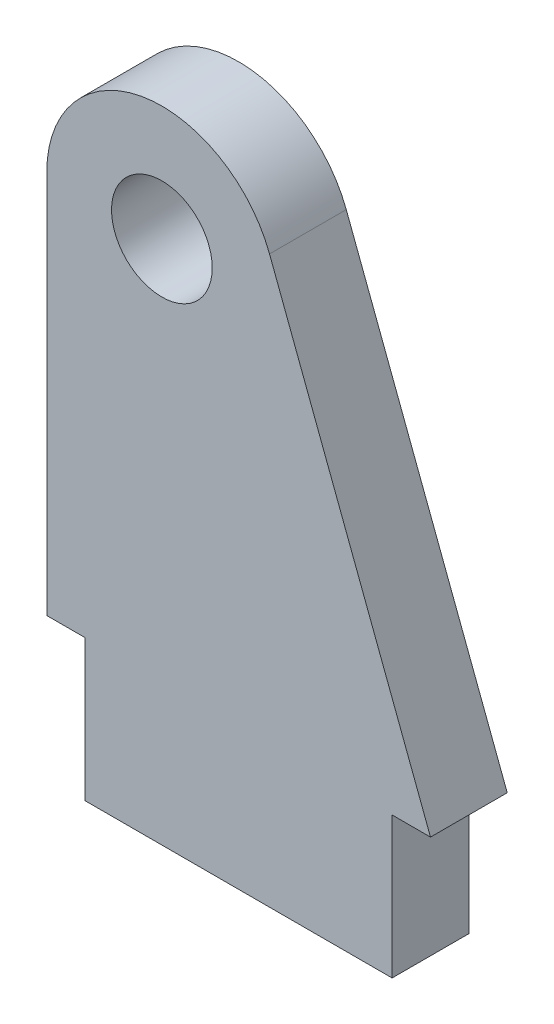
ISO-10303-21;
HEADER;
FILE_DESCRIPTION(('STEP AP214'),'2;1');
FILE_NAME('part.step','',(''),(''),'','','');
FILE_SCHEMA(('AUTOMOTIVE_DESIGN { 1 0 10303 214 1 1 1 1 }'));
ENDSEC;
DATA;
#1=APPLICATION_CONTEXT('core data for automotive mechanical design processes');
#2=APPLICATION_PROTOCOL_DEFINITION('international standard','automotive_design',2000,#1);
#3=PRODUCT_CONTEXT('',#1,'mechanical');
#4=PRODUCT('Part','Part','',(#3));
#5=PRODUCT_RELATED_PRODUCT_CATEGORY('part','',(#4));
#6=PRODUCT_DEFINITION_FORMATION('','',#4);
#7=PRODUCT_DEFINITION_CONTEXT('part definition',#1,'design');
#8=PRODUCT_DEFINITION('design','',#6,#7);
#9=PRODUCT_DEFINITION_SHAPE('','',#8);
#10=(LENGTH_UNIT() NAMED_UNIT(*) SI_UNIT(.MILLI.,.METRE.));
#11=(NAMED_UNIT(*) PLANE_ANGLE_UNIT() SI_UNIT($,.RADIAN.));
#12=(NAMED_UNIT(*) SI_UNIT($,.STERADIAN.) SOLID_ANGLE_UNIT());
#13=UNCERTAINTY_MEASURE_WITH_UNIT(LENGTH_MEASURE(1.E-05),#10,'distance_accuracy_value','');
#14=(GEOMETRIC_REPRESENTATION_CONTEXT(3) GLOBAL_UNCERTAINTY_ASSIGNED_CONTEXT((#13)) GLOBAL_UNIT_ASSIGNED_CONTEXT((#10,
#11,#12)) REPRESENTATION_CONTEXT('',''));
#15=CARTESIAN_POINT('',(0.,0.,0.));
#16=DIRECTION('',(0.,0.,1.));
#17=DIRECTION('',(1.,0.,0.));
#18=AXIS2_PLACEMENT_3D('',#15,#16,#17);
#19=CARTESIAN_POINT('',(-3.175,18.796,3.175));
#20=DIRECTION('',(0.,0.,1.));
#21=DIRECTION('',(1.,0.,0.));
#22=AXIS2_PLACEMENT_3D('',#19,#20,#21);
#23=PLANE('',#22);
#24=DIRECTION('',(1.,0.,0.));
#25=VECTOR('',#24,1.);
#26=CARTESIAN_POINT('',(-7.9375,2.921,3.175));
#27=LINE('',#26,#25);
#28=CARTESIAN_POINT('',(-7.9375,2.921,3.175));
#29=VERTEX_POINT('',#28);
#30=CARTESIAN_POINT('',(-6.35,2.921,3.175));
#31=VERTEX_POINT('',#30);
#32=EDGE_CURVE('E149',#29,#31,#27,.T.);
#33=ORIENTED_EDGE('',*,*,#32,.T.);
#34=DIRECTION('',(0.,-1.,0.));
#35=VECTOR('',#34,1.);
#36=CARTESIAN_POINT('',(-6.35,-2.921,3.175));
#37=LINE('',#36,#35);
#38=CARTESIAN_POINT('',(-6.35,-2.921,3.175));
#39=VERTEX_POINT('',#38);
#40=EDGE_CURVE('E97',#31,#39,#37,.T.);
#41=ORIENTED_EDGE('',*,*,#40,.T.);
#42=DIRECTION('',(1.,0.,0.));
#43=VECTOR('',#42,1.);
#44=CARTESIAN_POINT('',(6.35,-2.921,3.175));
#45=LINE('',#44,#43);
#46=CARTESIAN_POINT('',(6.35,-2.921,3.175));
#47=VERTEX_POINT('',#46);
#48=EDGE_CURVE('E164',#39,#47,#45,.T.);
#49=ORIENTED_EDGE('',*,*,#48,.T.);
#50=DIRECTION('',(0.,1.,0.));
#51=VECTOR('',#50,1.);
#52=CARTESIAN_POINT('',(6.35,-2.921,3.175));
#53=LINE('',#52,#51);
#54=CARTESIAN_POINT('',(6.35,2.921,3.175));
#55=VERTEX_POINT('',#54);
#56=EDGE_CURVE('E177',#47,#55,#53,.T.);
#57=ORIENTED_EDGE('',*,*,#56,.T.);
#58=DIRECTION('',(1.,0.,0.));
#59=VECTOR('',#58,1.);
#60=CARTESIAN_POINT('',(6.35,2.921,3.175));
#61=LINE('',#60,#59);
#62=CARTESIAN_POINT('',(7.9375,2.921,3.175));
#63=VERTEX_POINT('',#62);
#64=EDGE_CURVE('E116',#55,#63,#61,.T.);
#65=ORIENTED_EDGE('',*,*,#64,.T.);
#66=DIRECTION('',(-0.354530986331508,0.935044266187868,0.));
#67=VECTOR('',#66,1.);
#68=CARTESIAN_POINT('',(7.9375,2.921,3.175));
#69=LINE('',#68,#67);
#70=CARTESIAN_POINT('',(1.27814831771972,20.4844538224038,3.175));
#71=VERTEX_POINT('',#70);
#72=EDGE_CURVE('E110',#63,#71,#69,.T.);
#73=ORIENTED_EDGE('',*,*,#72,.T.);
#74=CARTESIAN_POINT('',(-3.175,18.796,3.175));
#75=DIRECTION('',(0.,0.,1.));
#76=DIRECTION('',(1.,0.,0.));
#77=AXIS2_PLACEMENT_3D('',#74,#75,#76);
#78=CIRCLE('',#77,4.7625);
#79=CARTESIAN_POINT('',(-7.9375,18.796,3.175));
#80=VERTEX_POINT('',#79);
#81=EDGE_CURVE('E114',#71,#80,#78,.T.);
#82=ORIENTED_EDGE('',*,*,#81,.T.);
#83=DIRECTION('',(0.,-1.,0.));
#84=VECTOR('',#83,1.);
#85=CARTESIAN_POINT('',(-7.9375,2.921,3.175));
#86=LINE('',#85,#84);
#87=EDGE_CURVE('E54',#80,#29,#86,.T.);
#88=ORIENTED_EDGE('',*,*,#87,.T.);
#89=EDGE_LOOP('',(#33,#41,#49,#57,#65,#73,#82,#88));
#90=FACE_BOUND('',#89,.T.);
#91=CARTESIAN_POINT('',(-3.175,18.796,3.175));
#92=DIRECTION('',(0.,0.,1.));
#93=DIRECTION('',(1.,0.,0.));
#94=AXIS2_PLACEMENT_3D('',#91,#92,#93);
#95=CIRCLE('',#94,2.0828);
#96=CARTESIAN_POINT('',(-1.0922,18.796,3.175));
#97=VERTEX_POINT('',#96);
#98=EDGE_CURVE('E138',#97,#97,#95,.T.);
#99=ORIENTED_EDGE('',*,*,#98,.F.);
#100=EDGE_LOOP('',(#99));
#101=FACE_BOUND('',#100,.T.);
#102=ADVANCED_FACE('F37',(#90,#101),#23,.T.);
#103=CARTESIAN_POINT('',(-3.175,18.796,0.));
#104=DIRECTION('',(0.,0.,1.));
#105=DIRECTION('',(1.,0.,0.));
#106=AXIS2_PLACEMENT_3D('',#103,#104,#105);
#107=PLANE('',#106);
#108=DIRECTION('',(1.,0.,0.));
#109=VECTOR('',#108,1.);
#110=CARTESIAN_POINT('',(-7.9375,2.921,0.));
#111=LINE('',#110,#109);
#112=CARTESIAN_POINT('',(-7.9375,2.921,0.));
#113=VERTEX_POINT('',#112);
#114=CARTESIAN_POINT('',(-6.35,2.921,0.));
#115=VERTEX_POINT('',#114);
#116=EDGE_CURVE('E134',#113,#115,#111,.T.);
#117=ORIENTED_EDGE('',*,*,#116,.F.);
#118=DIRECTION('',(0.,-1.,0.));
#119=VECTOR('',#118,1.);
#120=CARTESIAN_POINT('',(-7.9375,2.921,0.));
#121=LINE('',#120,#119);
#122=CARTESIAN_POINT('',(-7.9375,18.796,0.));
#123=VERTEX_POINT('',#122);
#124=EDGE_CURVE('E89',#123,#113,#121,.T.);
#125=ORIENTED_EDGE('',*,*,#124,.F.);
#126=CARTESIAN_POINT('',(-3.175,18.796,0.));
#127=DIRECTION('',(0.,0.,1.));
#128=DIRECTION('',(1.,0.,0.));
#129=AXIS2_PLACEMENT_3D('',#126,#127,#128);
#130=CIRCLE('',#129,4.7625);
#131=CARTESIAN_POINT('',(1.27814831771972,20.4844538224038,0.));
#132=VERTEX_POINT('',#131);
#133=EDGE_CURVE('E83',#132,#123,#130,.T.);
#134=ORIENTED_EDGE('',*,*,#133,.F.);
#135=DIRECTION('',(-0.354530986331508,0.935044266187868,0.));
#136=VECTOR('',#135,1.);
#137=CARTESIAN_POINT('',(7.9375,2.921,0.));
#138=LINE('',#137,#136);
#139=CARTESIAN_POINT('',(7.9375,2.921,0.));
#140=VERTEX_POINT('',#139);
#141=EDGE_CURVE('E124',#140,#132,#138,.T.);
#142=ORIENTED_EDGE('',*,*,#141,.F.);
#143=DIRECTION('',(1.,0.,0.));
#144=VECTOR('',#143,1.);
#145=CARTESIAN_POINT('',(6.35,2.921,0.));
#146=LINE('',#145,#144);
#147=CARTESIAN_POINT('',(6.35,2.921,0.));
#148=VERTEX_POINT('',#147);
#149=EDGE_CURVE('E144',#148,#140,#146,.T.);
#150=ORIENTED_EDGE('',*,*,#149,.F.);
#151=DIRECTION('',(0.,1.,0.));
#152=VECTOR('',#151,1.);
#153=CARTESIAN_POINT('',(6.35,-2.921,0.));
#154=LINE('',#153,#152);
#155=CARTESIAN_POINT('',(6.35,-2.921,0.));
#156=VERTEX_POINT('',#155);
#157=EDGE_CURVE('E142',#156,#148,#154,.T.);
#158=ORIENTED_EDGE('',*,*,#157,.F.);
#159=DIRECTION('',(1.,0.,0.));
#160=VECTOR('',#159,1.);
#161=CARTESIAN_POINT('',(6.35,-2.921,0.));
#162=LINE('',#161,#160);
#163=CARTESIAN_POINT('',(-6.35,-2.921,0.));
#164=VERTEX_POINT('',#163);
#165=EDGE_CURVE('E140',#164,#156,#162,.T.);
#166=ORIENTED_EDGE('',*,*,#165,.F.);
#167=DIRECTION('',(0.,-1.,0.));
#168=VECTOR('',#167,1.);
#169=CARTESIAN_POINT('',(-6.35,-2.921,0.));
#170=LINE('',#169,#168);
#171=EDGE_CURVE('E137',#115,#164,#170,.T.);
#172=ORIENTED_EDGE('',*,*,#171,.F.);
#173=EDGE_LOOP('',(#117,#125,#134,#142,#150,#158,#166,#172));
#174=FACE_BOUND('',#173,.T.);
#175=CARTESIAN_POINT('',(-3.175,18.796,0.));
#176=DIRECTION('',(0.,0.,1.));
#177=DIRECTION('',(1.,0.,0.));
#178=AXIS2_PLACEMENT_3D('',#175,#176,#177);
#179=CIRCLE('',#178,2.0828);
#180=CARTESIAN_POINT('',(-1.0922,18.796,0.));
#181=VERTEX_POINT('',#180);
#182=EDGE_CURVE('E183',#181,#181,#179,.T.);
#183=ORIENTED_EDGE('',*,*,#182,.T.);
#184=EDGE_LOOP('',(#183));
#185=FACE_BOUND('',#184,.T.);
#186=ADVANCED_FACE('F168',(#174,#185),#107,.F.);
#187=CARTESIAN_POINT('',(-7.9375,2.921,3.175));
#188=DIRECTION('',(0.,1.,0.));
#189=DIRECTION('',(0.,0.,1.));
#190=AXIS2_PLACEMENT_3D('',#187,#188,#189);
#191=PLANE('',#190);
#192=ORIENTED_EDGE('',*,*,#116,.T.);
#193=DIRECTION('',(0.,0.,-1.));
#194=VECTOR('',#193,1.);
#195=CARTESIAN_POINT('',(-6.35,2.921,3.175));
#196=LINE('',#195,#194);
#197=EDGE_CURVE('E11',#31,#115,#196,.T.);
#198=ORIENTED_EDGE('',*,*,#197,.F.);
#199=ORIENTED_EDGE('',*,*,#32,.F.);
#200=DIRECTION('',(0.,0.,-1.));
#201=VECTOR('',#200,1.);
#202=CARTESIAN_POINT('',(-7.9375,2.921,3.175));
#203=LINE('',#202,#201);
#204=EDGE_CURVE('E130',#29,#113,#203,.T.);
#205=ORIENTED_EDGE('',*,*,#204,.T.);
#206=EDGE_LOOP('',(#192,#198,#199,#205));
#207=FACE_BOUND('',#206,.T.);
#208=ADVANCED_FACE('F39',(#207),#191,.F.);
#209=CARTESIAN_POINT('',(-6.35,-2.921,3.175));
#210=DIRECTION('',(1.,0.,0.));
#211=DIRECTION('',(0.,0.,-1.));
#212=AXIS2_PLACEMENT_3D('',#209,#210,#211);
#213=PLANE('',#212);
#214=ORIENTED_EDGE('',*,*,#171,.T.);
#215=DIRECTION('',(0.,0.,-1.));
#216=VECTOR('',#215,1.);
#217=CARTESIAN_POINT('',(-6.35,-2.921,3.175));
#218=LINE('',#217,#216);
#219=EDGE_CURVE('E46',#39,#164,#218,.T.);
#220=ORIENTED_EDGE('',*,*,#219,.F.);
#221=ORIENTED_EDGE('',*,*,#40,.F.);
#222=ORIENTED_EDGE('',*,*,#197,.T.);
#223=EDGE_LOOP('',(#214,#220,#221,#222));
#224=FACE_BOUND('',#223,.T.);
#225=ADVANCED_FACE('F211',(#224),#213,.F.);
#226=CARTESIAN_POINT('',(6.35,-2.921,3.175));
#227=DIRECTION('',(0.,1.,0.));
#228=DIRECTION('',(-1.,0.,0.));
#229=AXIS2_PLACEMENT_3D('',#226,#227,#228);
#230=PLANE('',#229);
#231=ORIENTED_EDGE('',*,*,#165,.T.);
#232=DIRECTION('',(0.,0.,-1.));
#233=VECTOR('',#232,1.);
#234=CARTESIAN_POINT('',(6.35,-2.921,3.175));
#235=LINE('',#234,#233);
#236=EDGE_CURVE('E156',#47,#156,#235,.T.);
#237=ORIENTED_EDGE('',*,*,#236,.F.);
#238=ORIENTED_EDGE('',*,*,#48,.F.);
#239=ORIENTED_EDGE('',*,*,#219,.T.);
#240=EDGE_LOOP('',(#231,#237,#238,#239));
#241=FACE_BOUND('',#240,.T.);
#242=ADVANCED_FACE('F162',(#241),#230,.F.);
#243=CARTESIAN_POINT('',(6.35,-2.921,3.175));
#244=DIRECTION('',(-1.,0.,0.));
#245=DIRECTION('',(0.,0.,1.));
#246=AXIS2_PLACEMENT_3D('',#243,#244,#245);
#247=PLANE('',#246);
#248=ORIENTED_EDGE('',*,*,#157,.T.);
#249=DIRECTION('',(0.,0.,-1.));
#250=VECTOR('',#249,1.);
#251=CARTESIAN_POINT('',(6.35,2.921,3.175));
#252=LINE('',#251,#250);
#253=EDGE_CURVE('E153',#55,#148,#252,.T.);
#254=ORIENTED_EDGE('',*,*,#253,.F.);
#255=ORIENTED_EDGE('',*,*,#56,.F.);
#256=ORIENTED_EDGE('',*,*,#236,.T.);
#257=EDGE_LOOP('',(#248,#254,#255,#256));
#258=FACE_BOUND('',#257,.T.);
#259=ADVANCED_FACE('F173',(#258),#247,.F.);
#260=CARTESIAN_POINT('',(6.35,2.921,3.175));
#261=DIRECTION('',(0.,1.,0.));
#262=DIRECTION('',(-1.,0.,0.));
#263=AXIS2_PLACEMENT_3D('',#260,#261,#262);
#264=PLANE('',#263);
#265=ORIENTED_EDGE('',*,*,#149,.T.);
#266=DIRECTION('',(0.,0.,-1.));
#267=VECTOR('',#266,1.);
#268=CARTESIAN_POINT('',(7.9375,2.921,3.175));
#269=LINE('',#268,#267);
#270=EDGE_CURVE('E125',#63,#140,#269,.T.);
#271=ORIENTED_EDGE('',*,*,#270,.F.);
#272=ORIENTED_EDGE('',*,*,#64,.F.);
#273=ORIENTED_EDGE('',*,*,#253,.T.);
#274=EDGE_LOOP('',(#265,#271,#272,#273));
#275=FACE_BOUND('',#274,.T.);
#276=ADVANCED_FACE('F176',(#275),#264,.F.);
#277=CARTESIAN_POINT('',(7.9375,2.921,3.175));
#278=DIRECTION('',(-0.935044266187868,-0.354530986331507,0.));
#279=DIRECTION('',(0.354530986331508,-0.935044266187868,0.));
#280=AXIS2_PLACEMENT_3D('',#277,#278,#279);
#281=PLANE('',#280);
#282=ORIENTED_EDGE('',*,*,#141,.T.);
#283=DIRECTION('',(0.,0.,-1.));
#284=VECTOR('',#283,1.);
#285=CARTESIAN_POINT('',(1.27814831771972,20.4844538224038,3.175));
#286=LINE('',#285,#284);
#287=EDGE_CURVE('E121',#71,#132,#286,.T.);
#288=ORIENTED_EDGE('',*,*,#287,.F.);
#289=ORIENTED_EDGE('',*,*,#72,.F.);
#290=ORIENTED_EDGE('',*,*,#270,.T.);
#291=EDGE_LOOP('',(#282,#288,#289,#290));
#292=FACE_BOUND('',#291,.T.);
#293=ADVANCED_FACE('F122',(#292),#281,.F.);
#294=CARTESIAN_POINT('',(-3.175,18.796,3.175));
#295=DIRECTION('',(0.,0.,-1.));
#296=DIRECTION('',(-1.,0.,0.));
#297=AXIS2_PLACEMENT_3D('',#294,#295,#296);
#298=CYLINDRICAL_SURFACE('',#297,4.7625);
#299=ORIENTED_EDGE('',*,*,#133,.T.);
#300=DIRECTION('',(0.,0.,-1.));
#301=VECTOR('',#300,1.);
#302=CARTESIAN_POINT('',(-7.9375,18.796,3.175));
#303=LINE('',#302,#301);
#304=EDGE_CURVE('E126',#80,#123,#303,.T.);
#305=ORIENTED_EDGE('',*,*,#304,.F.);
#306=ORIENTED_EDGE('',*,*,#81,.F.);
#307=ORIENTED_EDGE('',*,*,#287,.T.);
#308=EDGE_LOOP('',(#299,#305,#306,#307));
#309=FACE_BOUND('',#308,.T.);
#310=ADVANCED_FACE('F128',(#309),#298,.T.);
#311=CARTESIAN_POINT('',(-7.9375,2.921,3.175));
#312=DIRECTION('',(1.,0.,0.));
#313=DIRECTION('',(0.,0.,-1.));
#314=AXIS2_PLACEMENT_3D('',#311,#312,#313);
#315=PLANE('',#314);
#316=ORIENTED_EDGE('',*,*,#124,.T.);
#317=ORIENTED_EDGE('',*,*,#204,.F.);
#318=ORIENTED_EDGE('',*,*,#87,.F.);
#319=ORIENTED_EDGE('',*,*,#304,.T.);
#320=EDGE_LOOP('',(#316,#317,#318,#319));
#321=FACE_BOUND('',#320,.T.);
#322=ADVANCED_FACE('F199',(#321),#315,.F.);
#323=CARTESIAN_POINT('',(-3.175,18.796,3.175));
#324=DIRECTION('',(0.,0.,-1.));
#325=DIRECTION('',(-1.,0.,0.));
#326=AXIS2_PLACEMENT_3D('',#323,#324,#325);
#327=CYLINDRICAL_SURFACE('',#326,2.0828);
#328=ORIENTED_EDGE('',*,*,#98,.T.);
#329=EDGE_LOOP('',(#328));
#330=FACE_BOUND('',#329,.T.);
#331=ORIENTED_EDGE('',*,*,#182,.F.);
#332=EDGE_LOOP('',(#331));
#333=FACE_BOUND('',#332,.T.);
#334=ADVANCED_FACE('F189',(#330,#333),#327,.F.);
#335=CLOSED_SHELL('',(#102,#186,#208,#225,#242,#259,#276,#293,#310,#322,#334));
#336=MANIFOLD_SOLID_BREP('B2',#335);
#337=ADVANCED_BREP_SHAPE_REPRESENTATION('',(#18,#336),#14);
#338=SHAPE_DEFINITION_REPRESENTATION(#9,#337);
ENDSEC;
END-ISO-10303-21;
